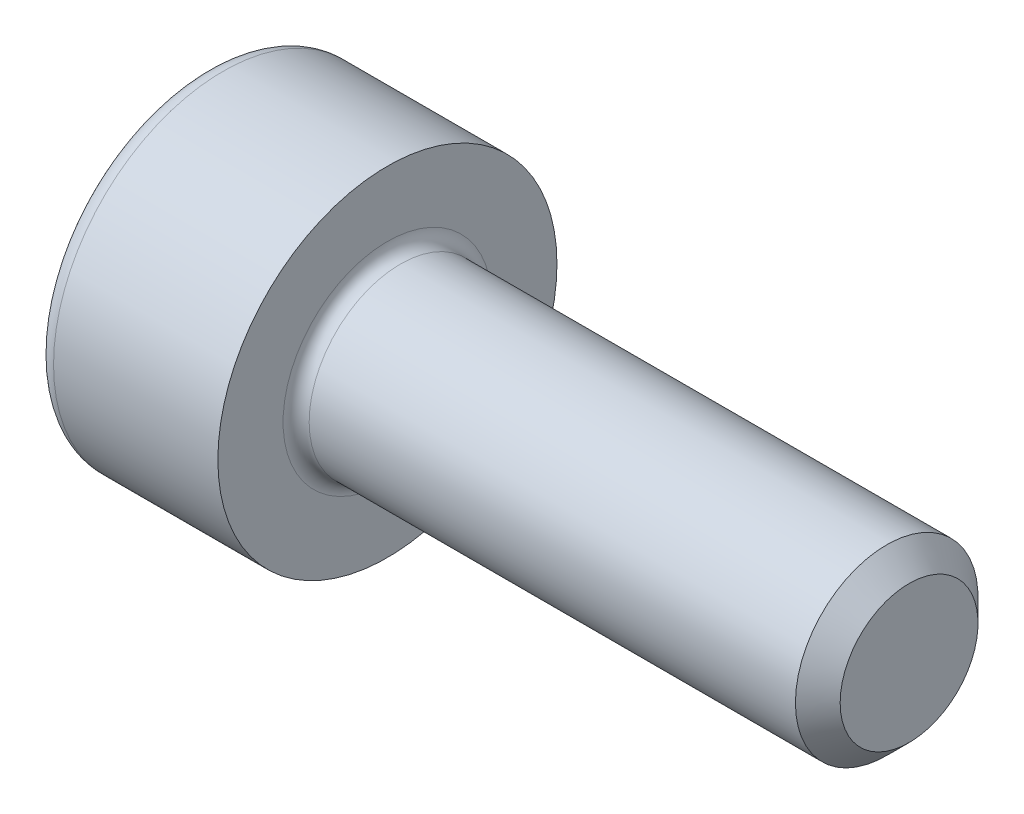
ISO-10303-21;
HEADER;
FILE_DESCRIPTION(('STEP AP214'),'2;1');
FILE_NAME('part.step','',(''),(''),'','','');
FILE_SCHEMA(('AUTOMOTIVE_DESIGN { 1 0 10303 214 1 1 1 1 }'));
ENDSEC;
DATA;
#1=APPLICATION_CONTEXT('core data for automotive mechanical design processes');
#2=APPLICATION_PROTOCOL_DEFINITION('international standard','automotive_design',2000,#1);
#3=PRODUCT_CONTEXT('',#1,'mechanical');
#4=PRODUCT('Part','Part','',(#3));
#5=PRODUCT_RELATED_PRODUCT_CATEGORY('part','',(#4));
#6=PRODUCT_DEFINITION_FORMATION('','',#4);
#7=PRODUCT_DEFINITION_CONTEXT('part definition',#1,'design');
#8=PRODUCT_DEFINITION('design','',#6,#7);
#9=PRODUCT_DEFINITION_SHAPE('','',#8);
#10=(LENGTH_UNIT() NAMED_UNIT(*) SI_UNIT(.MILLI.,.METRE.));
#11=(NAMED_UNIT(*) PLANE_ANGLE_UNIT() SI_UNIT($,.RADIAN.));
#12=(NAMED_UNIT(*) SI_UNIT($,.STERADIAN.) SOLID_ANGLE_UNIT());
#13=UNCERTAINTY_MEASURE_WITH_UNIT(LENGTH_MEASURE(1.E-05),#10,'distance_accuracy_value','');
#14=(GEOMETRIC_REPRESENTATION_CONTEXT(3) GLOBAL_UNCERTAINTY_ASSIGNED_CONTEXT((#13)) GLOBAL_UNIT_ASSIGNED_CONTEXT((#10,
#11,#12)) REPRESENTATION_CONTEXT('',''));
#15=CARTESIAN_POINT('',(0.,0.,0.));
#16=DIRECTION('',(0.,0.,1.));
#17=DIRECTION('',(1.,0.,0.));
#18=AXIS2_PLACEMENT_3D('',#15,#16,#17);
#19=CARTESIAN_POINT('',(0.,0.,0.));
#20=DIRECTION('',(-1.,0.,0.));
#21=DIRECTION('',(0.,0.,1.));
#22=AXIS2_PLACEMENT_3D('',#19,#20,#21);
#23=PLANE('',#22);
#24=DIRECTION('',(0.,-0.499999999999998,0.86602540378444));
#25=VECTOR('',#24,1.);
#26=CARTESIAN_POINT('',(0.,0.7621023553303,0.));
#27=LINE('',#26,#25);
#28=CARTESIAN_POINT('',(0.,0.7621023553303,0.));
#29=VERTEX_POINT('',#28);
#30=CARTESIAN_POINT('',(0.,0.381051177665149,0.659999999999998));
#31=VERTEX_POINT('',#30);
#32=EDGE_CURVE('E267',#29,#31,#27,.T.);
#33=ORIENTED_EDGE('',*,*,#32,.T.);
#34=DIRECTION('',(0.,1.,0.));
#35=VECTOR('',#34,1.);
#36=CARTESIAN_POINT('',(0.,-0.381051177665157,0.659999999999998));
#37=LINE('',#36,#35);
#38=CARTESIAN_POINT('',(0.,-0.381051177665157,0.659999999999998));
#39=VERTEX_POINT('',#38);
#40=EDGE_CURVE('E128',#39,#31,#37,.T.);
#41=ORIENTED_EDGE('',*,*,#40,.F.);
#42=DIRECTION('',(0.,-0.500000000000001,-0.866025403784438));
#43=VECTOR('',#42,1.);
#44=CARTESIAN_POINT('',(0.,-0.381051177665157,0.659999999999998));
#45=LINE('',#44,#43);
#46=CARTESIAN_POINT('',(0.,-0.76210235533031,0.));
#47=VERTEX_POINT('',#46);
#48=EDGE_CURVE('E270',#39,#47,#45,.T.);
#49=ORIENTED_EDGE('',*,*,#48,.T.);
#50=DIRECTION('',(0.,0.499999999999998,-0.86602540378444));
#51=VECTOR('',#50,1.);
#52=CARTESIAN_POINT('',(0.,-0.76210235533031,0.));
#53=LINE('',#52,#51);
#54=CARTESIAN_POINT('',(0.,-0.381051177665159,-0.660000000000002));
#55=VERTEX_POINT('',#54);
#56=EDGE_CURVE('E273',#47,#55,#53,.T.);
#57=ORIENTED_EDGE('',*,*,#56,.T.);
#58=DIRECTION('',(0.,-1.,0.));
#59=VECTOR('',#58,1.);
#60=CARTESIAN_POINT('',(0.,0.381051177665146,-0.660000000000002));
#61=LINE('',#60,#59);
#62=CARTESIAN_POINT('',(0.,0.381051177665146,-0.660000000000002));
#63=VERTEX_POINT('',#62);
#64=EDGE_CURVE('E276',#63,#55,#61,.T.);
#65=ORIENTED_EDGE('',*,*,#64,.F.);
#66=DIRECTION('',(0.,-0.500000000000001,-0.866025403784438));
#67=VECTOR('',#66,1.);
#68=CARTESIAN_POINT('',(0.,0.7621023553303,0.));
#69=LINE('',#68,#67);
#70=EDGE_CURVE('E123',#29,#63,#69,.T.);
#71=ORIENTED_EDGE('',*,*,#70,.F.);
#72=EDGE_LOOP('',(#33,#41,#49,#57,#65,#71));
#73=FACE_BOUND('',#72,.T.);
#74=CARTESIAN_POINT('',(0.,0.,0.));
#75=DIRECTION('',(-1.,0.,0.));
#76=DIRECTION('',(0.,0.,1.));
#77=AXIS2_PLACEMENT_3D('',#74,#75,#76);
#78=CIRCLE('',#77,1.16);
#79=CARTESIAN_POINT('',(0.,0.,1.16));
#80=VERTEX_POINT('',#79);
#81=EDGE_CURVE('E44',#80,#80,#78,.T.);
#82=ORIENTED_EDGE('',*,*,#81,.T.);
#83=EDGE_LOOP('',(#82));
#84=FACE_BOUND('',#83,.T.);
#85=ADVANCED_FACE('F36',(#73,#84),#23,.T.);
#86=CARTESIAN_POINT('',(-31.75,0.,0.));
#87=DIRECTION('',(-1.,0.,0.));
#88=DIRECTION('',(0.,0.,1.));
#89=AXIS2_PLACEMENT_3D('',#86,#87,#88);
#90=CYLINDRICAL_SURFACE('',#89,1.3);
#91=CARTESIAN_POINT('',(0.140000000000001,0.,0.));
#92=DIRECTION('',(-1.,0.,0.));
#93=DIRECTION('',(0.,0.,1.));
#94=AXIS2_PLACEMENT_3D('',#91,#92,#93);
#95=CIRCLE('',#94,1.3);
#96=CARTESIAN_POINT('',(0.140000000000001,0.,1.3));
#97=VERTEX_POINT('',#96);
#98=EDGE_CURVE('E11',#97,#97,#95,.F.);
#99=ORIENTED_EDGE('',*,*,#98,.T.);
#100=EDGE_LOOP('',(#99));
#101=FACE_BOUND('',#100,.T.);
#102=CARTESIAN_POINT('',(1.4,0.,0.));
#103=DIRECTION('',(-1.,0.,0.));
#104=DIRECTION('',(0.,0.,1.));
#105=AXIS2_PLACEMENT_3D('',#102,#103,#104);
#106=CIRCLE('',#105,1.3);
#107=CARTESIAN_POINT('',(1.4,0.,1.3));
#108=VERTEX_POINT('',#107);
#109=EDGE_CURVE('E146',#108,#108,#106,.T.);
#110=ORIENTED_EDGE('',*,*,#109,.T.);
#111=EDGE_LOOP('',(#110));
#112=FACE_BOUND('',#111,.T.);
#113=ADVANCED_FACE('F170',(#101,#112),#90,.T.);
#114=CARTESIAN_POINT('',(1.4,1.3,0.));
#115=DIRECTION('',(1.,0.,0.));
#116=DIRECTION('',(0.,0.,-1.));
#117=AXIS2_PLACEMENT_3D('',#114,#115,#116);
#118=PLANE('',#117);
#119=CARTESIAN_POINT('',(1.4,0.,0.));
#120=DIRECTION('',(1.,0.,0.));
#121=DIRECTION('',(0.,0.,-1.));
#122=AXIS2_PLACEMENT_3D('',#119,#120,#121);
#123=CIRCLE('',#122,0.799999999999998);
#124=CARTESIAN_POINT('',(1.4,0.,-0.799999999999998));
#125=VERTEX_POINT('',#124);
#126=EDGE_CURVE('E149',#125,#125,#123,.F.);
#127=ORIENTED_EDGE('',*,*,#126,.T.);
#128=EDGE_LOOP('',(#127));
#129=FACE_BOUND('',#128,.T.);
#130=ORIENTED_EDGE('',*,*,#109,.F.);
#131=EDGE_LOOP('',(#130));
#132=FACE_BOUND('',#131,.T.);
#133=ADVANCED_FACE('F176',(#129,#132),#118,.T.);
#134=CARTESIAN_POINT('',(-31.75,0.,0.));
#135=DIRECTION('',(-1.,0.,0.));
#136=DIRECTION('',(0.,0.,1.));
#137=AXIS2_PLACEMENT_3D('',#134,#135,#136);
#138=CYLINDRICAL_SURFACE('',#137,0.699999999999998);
#139=CARTESIAN_POINT('',(1.5,0.,0.));
#140=DIRECTION('',(1.,0.,0.));
#141=DIRECTION('',(0.,0.,-1.));
#142=AXIS2_PLACEMENT_3D('',#139,#140,#141);
#143=CIRCLE('',#142,0.699999999999998);
#144=CARTESIAN_POINT('',(1.5,0.,-0.699999999999998));
#145=VERTEX_POINT('',#144);
#146=EDGE_CURVE('E152',#145,#145,#143,.T.);
#147=ORIENTED_EDGE('',*,*,#146,.T.);
#148=EDGE_LOOP('',(#147));
#149=FACE_BOUND('',#148,.T.);
#150=CARTESIAN_POINT('',(5.2285,0.,0.));
#151=DIRECTION('',(-1.,0.,0.));
#152=DIRECTION('',(0.,0.,1.));
#153=AXIS2_PLACEMENT_3D('',#150,#151,#152);
#154=CIRCLE('',#153,0.699999999999997);
#155=CARTESIAN_POINT('',(5.2285,0.,0.699999999999997));
#156=VERTEX_POINT('',#155);
#157=EDGE_CURVE('E143',#156,#156,#154,.T.);
#158=ORIENTED_EDGE('',*,*,#157,.T.);
#159=EDGE_LOOP('',(#158));
#160=FACE_BOUND('',#159,.T.);
#161=ADVANCED_FACE('F182',(#149,#160),#138,.T.);
#162=CARTESIAN_POINT('',(5.4,0.,0.));
#163=DIRECTION('',(-1.,0.,0.));
#164=DIRECTION('',(0.,0.,1.));
#165=AXIS2_PLACEMENT_3D('',#162,#163,#164);
#166=CONICAL_SURFACE('',#165,0.5285,0.785398163397426);
#167=ORIENTED_EDGE('',*,*,#157,.F.);
#168=EDGE_LOOP('',(#167));
#169=FACE_BOUND('',#168,.T.);
#170=CARTESIAN_POINT('',(5.4,0.,0.));
#171=DIRECTION('',(-1.,0.,0.));
#172=DIRECTION('',(0.,0.,1.));
#173=AXIS2_PLACEMENT_3D('',#170,#171,#172);
#174=CIRCLE('',#173,0.5285);
#175=CARTESIAN_POINT('',(5.4,0.,0.5285));
#176=VERTEX_POINT('',#175);
#177=EDGE_CURVE('E139',#176,#176,#174,.T.);
#178=ORIENTED_EDGE('',*,*,#177,.T.);
#179=EDGE_LOOP('',(#178));
#180=FACE_BOUND('',#179,.T.);
#181=ADVANCED_FACE('F186',(#169,#180),#166,.T.);
#182=CARTESIAN_POINT('',(5.4,0.5285,0.));
#183=DIRECTION('',(1.,0.,0.));
#184=DIRECTION('',(0.,0.,-1.));
#185=AXIS2_PLACEMENT_3D('',#182,#183,#184);
#186=PLANE('',#185);
#187=ORIENTED_EDGE('',*,*,#177,.F.);
#188=EDGE_LOOP('',(#187));
#189=FACE_BOUND('',#188,.T.);
#190=ADVANCED_FACE('F166',(#189),#186,.T.);
#191=CARTESIAN_POINT('',(1.5,0.,0.));
#192=DIRECTION('',(1.,0.,0.));
#193=DIRECTION('',(0.,0.,-1.));
#194=AXIS2_PLACEMENT_3D('',#191,#192,#193);
#195=TOROIDAL_SURFACE('',#194,0.799999999999998,0.1);
#196=ORIENTED_EDGE('',*,*,#146,.F.);
#197=EDGE_LOOP('',(#196));
#198=FACE_BOUND('',#197,.T.);
#199=ORIENTED_EDGE('',*,*,#126,.F.);
#200=EDGE_LOOP('',(#199));
#201=FACE_BOUND('',#200,.T.);
#202=ADVANCED_FACE('F159',(#198,#201),#195,.F.);
#203=CARTESIAN_POINT('',(0.140000000000001,0.,0.));
#204=DIRECTION('',(-1.,0.,0.));
#205=DIRECTION('',(0.,0.,1.));
#206=AXIS2_PLACEMENT_3D('',#203,#204,#205);
#207=TOROIDAL_SURFACE('',#206,1.16,0.14);
#208=ORIENTED_EDGE('',*,*,#98,.F.);
#209=EDGE_LOOP('',(#208));
#210=FACE_BOUND('',#209,.T.);
#211=ORIENTED_EDGE('',*,*,#81,.F.);
#212=EDGE_LOOP('',(#211));
#213=FACE_BOUND('',#212,.T.);
#214=ADVANCED_FACE('F38',(#210,#213),#207,.T.);
#215=CARTESIAN_POINT('',(0.6,0.7621023553303,0.));
#216=DIRECTION('',(0.,-0.86602540378444,-0.499999999999998));
#217=DIRECTION('',(0.,0.499999999999998,-0.86602540378444));
#218=AXIS2_PLACEMENT_3D('',#215,#216,#217);
#219=PLANE('',#218);
#220=ORIENTED_EDGE('',*,*,#32,.F.);
#221=DIRECTION('',(-1.,0.,0.));
#222=VECTOR('',#221,1.);
#223=CARTESIAN_POINT('',(0.6,0.7621023553303,0.));
#224=LINE('',#223,#222);
#225=CARTESIAN_POINT('',(0.6,0.7621023553303,0.));
#226=VERTEX_POINT('',#225);
#227=EDGE_CURVE('E266',#226,#29,#224,.T.);
#228=ORIENTED_EDGE('',*,*,#227,.F.);
#229=DIRECTION('',(0.,-0.499999999999998,0.86602540378444));
#230=VECTOR('',#229,1.);
#231=CARTESIAN_POINT('',(0.6,0.7621023553303,0.));
#232=LINE('',#231,#230);
#233=CARTESIAN_POINT('',(0.6,0.57157676649773,0.329999999999998));
#234=VERTEX_POINT('',#233);
#235=EDGE_CURVE('E51',#226,#234,#232,.T.);
#236=ORIENTED_EDGE('',*,*,#235,.T.);
#237=CARTESIAN_POINT('',(0.6,0.381051177665149,0.659999999999998));
#238=VERTEX_POINT('',#237);
#239=EDGE_CURVE('E109',#234,#238,#232,.T.);
#240=ORIENTED_EDGE('',*,*,#239,.T.);
#241=DIRECTION('',(-1.,0.,0.));
#242=VECTOR('',#241,1.);
#243=CARTESIAN_POINT('',(0.6,0.381051177665149,0.659999999999998));
#244=LINE('',#243,#242);
#245=EDGE_CURVE('E121',#238,#31,#244,.T.);
#246=ORIENTED_EDGE('',*,*,#245,.T.);
#247=EDGE_LOOP('',(#220,#228,#236,#240,#246));
#248=FACE_BOUND('',#247,.T.);
#249=ADVANCED_FACE('F120',(#248),#219,.T.);
#250=CARTESIAN_POINT('',(0.6,-0.381051177665157,0.659999999999998));
#251=DIRECTION('',(0.,0.,1.));
#252=DIRECTION('',(0.,-1.,0.));
#253=AXIS2_PLACEMENT_3D('',#250,#251,#252);
#254=PLANE('',#253);
#255=ORIENTED_EDGE('',*,*,#40,.T.);
#256=ORIENTED_EDGE('',*,*,#245,.F.);
#257=DIRECTION('',(0.,1.,0.));
#258=VECTOR('',#257,1.);
#259=CARTESIAN_POINT('',(0.6,-0.381051177665157,0.659999999999998));
#260=LINE('',#259,#258);
#261=CARTESIAN_POINT('',(0.6,0.,0.659999999999998));
#262=VERTEX_POINT('',#261);
#263=EDGE_CURVE('E107',#262,#238,#260,.T.);
#264=ORIENTED_EDGE('',*,*,#263,.F.);
#265=CARTESIAN_POINT('',(0.6,-0.381051177665157,0.659999999999998));
#266=VERTEX_POINT('',#265);
#267=EDGE_CURVE('E117',#266,#262,#260,.T.);
#268=ORIENTED_EDGE('',*,*,#267,.F.);
#269=DIRECTION('',(-1.,0.,0.));
#270=VECTOR('',#269,1.);
#271=CARTESIAN_POINT('',(0.6,-0.381051177665157,0.659999999999998));
#272=LINE('',#271,#270);
#273=EDGE_CURVE('E130',#266,#39,#272,.T.);
#274=ORIENTED_EDGE('',*,*,#273,.T.);
#275=EDGE_LOOP('',(#255,#256,#264,#268,#274));
#276=FACE_BOUND('',#275,.T.);
#277=ADVANCED_FACE('F125',(#276),#254,.F.);
#278=CARTESIAN_POINT('',(0.6,-0.381051177665157,0.659999999999998));
#279=DIRECTION('',(0.,0.866025403784438,-0.500000000000001));
#280=DIRECTION('',(0.,0.500000000000001,0.866025403784438));
#281=AXIS2_PLACEMENT_3D('',#278,#279,#280);
#282=PLANE('',#281);
#283=ORIENTED_EDGE('',*,*,#48,.F.);
#284=ORIENTED_EDGE('',*,*,#273,.F.);
#285=DIRECTION('',(0.,-0.500000000000001,-0.866025403784438));
#286=VECTOR('',#285,1.);
#287=CARTESIAN_POINT('',(0.6,-0.381051177665157,0.659999999999998));
#288=LINE('',#287,#286);
#289=CARTESIAN_POINT('',(0.6,-0.571576766497731,0.330000000000002));
#290=VERTEX_POINT('',#289);
#291=EDGE_CURVE('E247',#266,#290,#288,.T.);
#292=ORIENTED_EDGE('',*,*,#291,.T.);
#293=CARTESIAN_POINT('',(0.6,-0.76210235533031,0.));
#294=VERTEX_POINT('',#293);
#295=EDGE_CURVE('E249',#290,#294,#288,.T.);
#296=ORIENTED_EDGE('',*,*,#295,.T.);
#297=DIRECTION('',(-1.,0.,0.));
#298=VECTOR('',#297,1.);
#299=CARTESIAN_POINT('',(0.6,-0.76210235533031,0.));
#300=LINE('',#299,#298);
#301=EDGE_CURVE('E135',#294,#47,#300,.T.);
#302=ORIENTED_EDGE('',*,*,#301,.T.);
#303=EDGE_LOOP('',(#283,#284,#292,#296,#302));
#304=FACE_BOUND('',#303,.T.);
#305=ADVANCED_FACE('F199',(#304),#282,.T.);
#306=CARTESIAN_POINT('',(0.6,-0.76210235533031,0.));
#307=DIRECTION('',(0.,0.86602540378444,0.499999999999998));
#308=DIRECTION('',(0.,-0.499999999999998,0.86602540378444));
#309=AXIS2_PLACEMENT_3D('',#306,#307,#308);
#310=PLANE('',#309);
#311=ORIENTED_EDGE('',*,*,#56,.F.);
#312=ORIENTED_EDGE('',*,*,#301,.F.);
#313=DIRECTION('',(0.,0.499999999999998,-0.86602540378444));
#314=VECTOR('',#313,1.);
#315=CARTESIAN_POINT('',(0.6,-0.76210235533031,0.));
#316=LINE('',#315,#314);
#317=CARTESIAN_POINT('',(0.6,-0.571576766497735,-0.330000000000001));
#318=VERTEX_POINT('',#317);
#319=EDGE_CURVE('E252',#294,#318,#316,.T.);
#320=ORIENTED_EDGE('',*,*,#319,.T.);
#321=CARTESIAN_POINT('',(0.6,-0.381051177665159,-0.660000000000002));
#322=VERTEX_POINT('',#321);
#323=EDGE_CURVE('E256',#318,#322,#316,.T.);
#324=ORIENTED_EDGE('',*,*,#323,.T.);
#325=DIRECTION('',(-1.,0.,0.));
#326=VECTOR('',#325,1.);
#327=CARTESIAN_POINT('',(0.6,-0.381051177665159,-0.660000000000002));
#328=LINE('',#327,#326);
#329=EDGE_CURVE('E285',#322,#55,#328,.T.);
#330=ORIENTED_EDGE('',*,*,#329,.T.);
#331=EDGE_LOOP('',(#311,#312,#320,#324,#330));
#332=FACE_BOUND('',#331,.T.);
#333=ADVANCED_FACE('F202',(#332),#310,.T.);
#334=CARTESIAN_POINT('',(0.6,0.381051177665146,-0.660000000000002));
#335=DIRECTION('',(0.,0.,-1.));
#336=DIRECTION('',(0.,1.,0.));
#337=AXIS2_PLACEMENT_3D('',#334,#335,#336);
#338=PLANE('',#337);
#339=ORIENTED_EDGE('',*,*,#64,.T.);
#340=ORIENTED_EDGE('',*,*,#329,.F.);
#341=DIRECTION('',(0.,-1.,0.));
#342=VECTOR('',#341,1.);
#343=CARTESIAN_POINT('',(0.6,0.381051177665146,-0.660000000000002));
#344=LINE('',#343,#342);
#345=CARTESIAN_POINT('',(0.6,0.,-0.660000000000002));
#346=VERTEX_POINT('',#345);
#347=EDGE_CURVE('E260',#346,#322,#344,.T.);
#348=ORIENTED_EDGE('',*,*,#347,.F.);
#349=CARTESIAN_POINT('',(0.6,0.381051177665146,-0.660000000000002));
#350=VERTEX_POINT('',#349);
#351=EDGE_CURVE('E261',#350,#346,#344,.T.);
#352=ORIENTED_EDGE('',*,*,#351,.F.);
#353=DIRECTION('',(-1.,0.,0.));
#354=VECTOR('',#353,1.);
#355=CARTESIAN_POINT('',(0.6,0.381051177665146,-0.660000000000002));
#356=LINE('',#355,#354);
#357=EDGE_CURVE('E282',#350,#63,#356,.T.);
#358=ORIENTED_EDGE('',*,*,#357,.T.);
#359=EDGE_LOOP('',(#339,#340,#348,#352,#358));
#360=FACE_BOUND('',#359,.T.);
#361=ADVANCED_FACE('F206',(#360),#338,.F.);
#362=CARTESIAN_POINT('',(0.6,0.7621023553303,0.));
#363=DIRECTION('',(0.,0.866025403784438,-0.500000000000001));
#364=DIRECTION('',(0.,0.500000000000001,0.866025403784438));
#365=AXIS2_PLACEMENT_3D('',#362,#363,#364);
#366=PLANE('',#365);
#367=ORIENTED_EDGE('',*,*,#70,.T.);
#368=ORIENTED_EDGE('',*,*,#357,.F.);
#369=DIRECTION('',(0.,-0.500000000000001,-0.866025403784438));
#370=VECTOR('',#369,1.);
#371=CARTESIAN_POINT('',(0.6,0.7621023553303,0.));
#372=LINE('',#371,#370);
#373=CARTESIAN_POINT('',(0.6,0.571576766497725,-0.329999999999998));
#374=VERTEX_POINT('',#373);
#375=EDGE_CURVE('E264',#374,#350,#372,.T.);
#376=ORIENTED_EDGE('',*,*,#375,.F.);
#377=EDGE_CURVE('E238',#226,#374,#372,.T.);
#378=ORIENTED_EDGE('',*,*,#377,.F.);
#379=ORIENTED_EDGE('',*,*,#227,.T.);
#380=EDGE_LOOP('',(#367,#368,#376,#378,#379));
#381=FACE_BOUND('',#380,.T.);
#382=ADVANCED_FACE('F210',(#381),#366,.F.);
#383=CARTESIAN_POINT('',(0.6,0.381051177665149,0.659999999999998));
#384=DIRECTION('',(-1.,0.,0.));
#385=DIRECTION('',(0.,0.,1.));
#386=AXIS2_PLACEMENT_3D('',#383,#384,#385);
#387=PLANE('',#386);
#388=CARTESIAN_POINT('',(0.6,0.,0.));
#389=DIRECTION('',(-1.,0.,0.));
#390=DIRECTION('',(0.,0.,1.));
#391=AXIS2_PLACEMENT_3D('',#388,#389,#390);
#392=CIRCLE('',#391,0.659999999999999);
#393=EDGE_CURVE('E129',#290,#262,#392,.T.);
#394=ORIENTED_EDGE('',*,*,#393,.F.);
#395=ORIENTED_EDGE('',*,*,#291,.F.);
#396=ORIENTED_EDGE('',*,*,#267,.T.);
#397=EDGE_LOOP('',(#394,#395,#396));
#398=FACE_BOUND('',#397,.T.);
#399=ADVANCED_FACE('F214',(#398),#387,.T.);
#400=EDGE_CURVE('E133',#318,#290,#392,.T.);
#401=ORIENTED_EDGE('',*,*,#400,.F.);
#402=ORIENTED_EDGE('',*,*,#319,.F.);
#403=ORIENTED_EDGE('',*,*,#295,.F.);
#404=EDGE_LOOP('',(#401,#402,#403));
#405=FACE_BOUND('',#404,.T.);
#406=ADVANCED_FACE('F217',(#405),#387,.T.);
#407=EDGE_CURVE('E291',#346,#318,#392,.T.);
#408=ORIENTED_EDGE('',*,*,#407,.F.);
#409=ORIENTED_EDGE('',*,*,#347,.T.);
#410=ORIENTED_EDGE('',*,*,#323,.F.);
#411=EDGE_LOOP('',(#408,#409,#410));
#412=FACE_BOUND('',#411,.T.);
#413=ADVANCED_FACE('F222',(#412),#387,.T.);
#414=EDGE_CURVE('E241',#374,#346,#392,.T.);
#415=ORIENTED_EDGE('',*,*,#414,.F.);
#416=ORIENTED_EDGE('',*,*,#375,.T.);
#417=ORIENTED_EDGE('',*,*,#351,.T.);
#418=EDGE_LOOP('',(#415,#416,#417));
#419=FACE_BOUND('',#418,.T.);
#420=ADVANCED_FACE('F229',(#419),#387,.T.);
#421=EDGE_CURVE('E140',#234,#374,#392,.T.);
#422=ORIENTED_EDGE('',*,*,#421,.F.);
#423=ORIENTED_EDGE('',*,*,#235,.F.);
#424=ORIENTED_EDGE('',*,*,#377,.T.);
#425=EDGE_LOOP('',(#422,#423,#424));
#426=FACE_BOUND('',#425,.T.);
#427=ADVANCED_FACE('F225',(#426),#387,.T.);
#428=EDGE_CURVE('E112',#262,#234,#392,.T.);
#429=ORIENTED_EDGE('',*,*,#428,.F.);
#430=ORIENTED_EDGE('',*,*,#263,.T.);
#431=ORIENTED_EDGE('',*,*,#239,.F.);
#432=EDGE_LOOP('',(#429,#430,#431));
#433=FACE_BOUND('',#432,.T.);
#434=ADVANCED_FACE('F108',(#433),#387,.T.);
#435=CARTESIAN_POINT('',(0.6,0.,0.));
#436=DIRECTION('',(-1.,0.,0.));
#437=DIRECTION('',(0.,0.,1.));
#438=AXIS2_PLACEMENT_3D('',#435,#436,#437);
#439=CONICAL_SURFACE('',#438,0.659999999999999,1.04719755119658);
#440=CARTESIAN_POINT('',(0.981051177665164,0.,0.));
#441=VERTEX_POINT('',#440);
#442=VERTEX_LOOP('',#441);
#443=FACE_BOUND('',#442,.T.);
#444=ORIENTED_EDGE('',*,*,#428,.T.);
#445=ORIENTED_EDGE('',*,*,#421,.T.);
#446=ORIENTED_EDGE('',*,*,#414,.T.);
#447=ORIENTED_EDGE('',*,*,#407,.T.);
#448=ORIENTED_EDGE('',*,*,#400,.T.);
#449=ORIENTED_EDGE('',*,*,#393,.T.);
#450=EDGE_LOOP('',(#444,#445,#446,#447,#448,#449));
#451=FACE_BOUND('',#450,.T.);
#452=ADVANCED_FACE('F194',(#443,#451),#439,.F.);
#453=CLOSED_SHELL('',(#85,#113,#133,#161,#181,#190,#202,#214,#249,#277,#305,#333,#361,#382,#399,
#406,#413,#420,#427,#434,#452));
#454=MANIFOLD_SOLID_BREP('B2',#453);
#455=ADVANCED_BREP_SHAPE_REPRESENTATION('',(#18,#454),#14);
#456=SHAPE_DEFINITION_REPRESENTATION(#9,#455);
ENDSEC;
END-ISO-10303-21;
